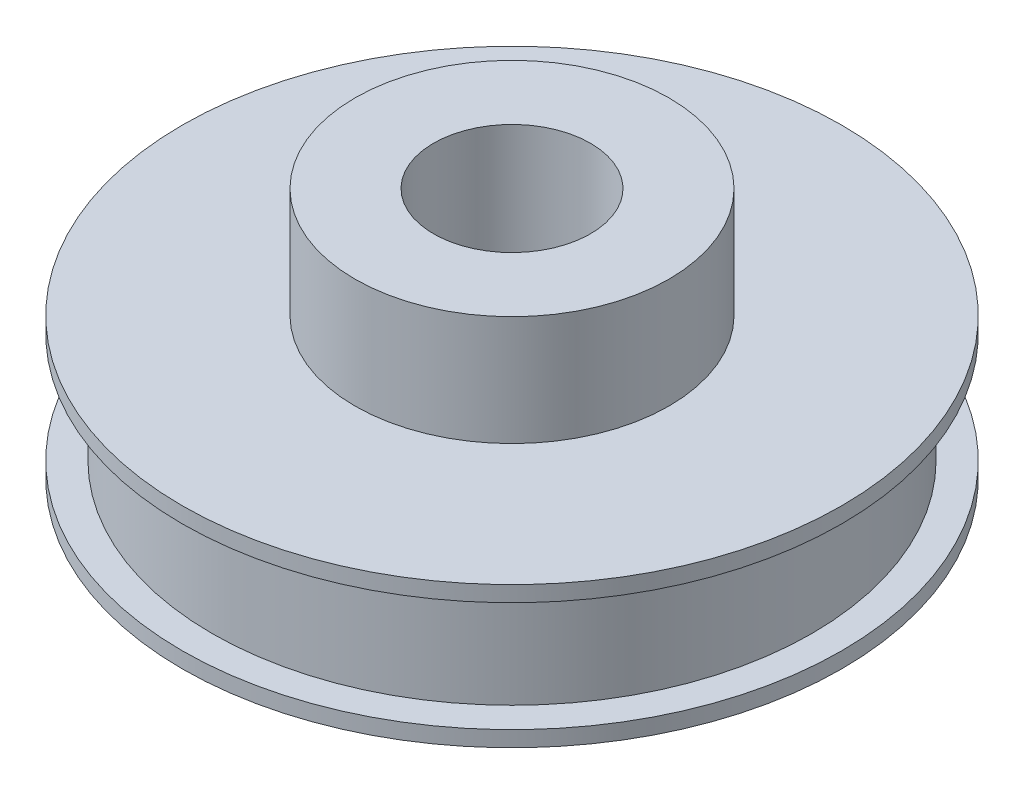
ISO-10303-21;
HEADER;
FILE_DESCRIPTION(('STEP AP214'),'2;1');
FILE_NAME('part.step','',(''),(''),'','','');
FILE_SCHEMA(('AUTOMOTIVE_DESIGN { 1 0 10303 214 1 1 1 1 }'));
ENDSEC;
DATA;
#1=APPLICATION_CONTEXT('core data for automotive mechanical design processes');
#2=APPLICATION_PROTOCOL_DEFINITION('international standard','automotive_design',2000,#1);
#3=PRODUCT_CONTEXT('',#1,'mechanical');
#4=PRODUCT('Part','Part','',(#3));
#5=PRODUCT_RELATED_PRODUCT_CATEGORY('part','',(#4));
#6=PRODUCT_DEFINITION_FORMATION('','',#4);
#7=PRODUCT_DEFINITION_CONTEXT('part definition',#1,'design');
#8=PRODUCT_DEFINITION('design','',#6,#7);
#9=PRODUCT_DEFINITION_SHAPE('','',#8);
#10=(LENGTH_UNIT() NAMED_UNIT(*) SI_UNIT(.MILLI.,.METRE.));
#11=(NAMED_UNIT(*) PLANE_ANGLE_UNIT() SI_UNIT($,.RADIAN.));
#12=(NAMED_UNIT(*) SI_UNIT($,.STERADIAN.) SOLID_ANGLE_UNIT());
#13=UNCERTAINTY_MEASURE_WITH_UNIT(LENGTH_MEASURE(1.E-05),#10,'distance_accuracy_value','');
#14=(GEOMETRIC_REPRESENTATION_CONTEXT(3) GLOBAL_UNCERTAINTY_ASSIGNED_CONTEXT((#13)) GLOBAL_UNIT_ASSIGNED_CONTEXT((#10,
#11,#12)) REPRESENTATION_CONTEXT('',''));
#15=CARTESIAN_POINT('',(0.,0.,0.));
#16=DIRECTION('',(0.,0.,1.));
#17=DIRECTION('',(1.,0.,0.));
#18=AXIS2_PLACEMENT_3D('',#15,#16,#17);
#19=CARTESIAN_POINT('',(0.,0.,0.));
#20=DIRECTION('',(0.,-1.,0.));
#21=DIRECTION('',(0.,0.,-1.));
#22=AXIS2_PLACEMENT_3D('',#19,#20,#21);
#23=CYLINDRICAL_SURFACE('',#22,10.);
#24=CARTESIAN_POINT('',(0.,16.,0.));
#25=DIRECTION('',(0.,-1.,0.));
#26=DIRECTION('',(0.,0.,-1.));
#27=AXIS2_PLACEMENT_3D('',#24,#25,#26);
#28=CIRCLE('',#27,10.);
#29=CARTESIAN_POINT('',(0.,16.,-10.));
#30=VERTEX_POINT('',#29);
#31=EDGE_CURVE('E10',#30,#30,#28,.T.);
#32=ORIENTED_EDGE('',*,*,#31,.T.);
#33=EDGE_LOOP('',(#32));
#34=FACE_BOUND('',#33,.T.);
#35=CARTESIAN_POINT('',(0.,9.,0.));
#36=DIRECTION('',(0.,-1.,0.));
#37=DIRECTION('',(0.,0.,-1.));
#38=AXIS2_PLACEMENT_3D('',#35,#36,#37);
#39=CIRCLE('',#38,10.);
#40=CARTESIAN_POINT('',(0.,9.,-10.));
#41=VERTEX_POINT('',#40);
#42=EDGE_CURVE('E69',#41,#41,#39,.T.);
#43=ORIENTED_EDGE('',*,*,#42,.F.);
#44=EDGE_LOOP('',(#43));
#45=FACE_BOUND('',#44,.T.);
#46=ADVANCED_FACE('F35',(#34,#45),#23,.T.);
#47=CARTESIAN_POINT('',(5.,16.,0.));
#48=DIRECTION('',(0.,1.,0.));
#49=DIRECTION('',(0.,0.,1.));
#50=AXIS2_PLACEMENT_3D('',#47,#48,#49);
#51=PLANE('',#50);
#52=CARTESIAN_POINT('',(0.,16.,0.));
#53=DIRECTION('',(0.,-1.,0.));
#54=DIRECTION('',(0.,0.,-1.));
#55=AXIS2_PLACEMENT_3D('',#52,#53,#54);
#56=CIRCLE('',#55,5.);
#57=CARTESIAN_POINT('',(0.,16.,-5.));
#58=VERTEX_POINT('',#57);
#59=EDGE_CURVE('E41',#58,#58,#56,.T.);
#60=ORIENTED_EDGE('',*,*,#59,.T.);
#61=EDGE_LOOP('',(#60));
#62=FACE_BOUND('',#61,.T.);
#63=ORIENTED_EDGE('',*,*,#31,.F.);
#64=EDGE_LOOP('',(#63));
#65=FACE_BOUND('',#64,.T.);
#66=ADVANCED_FACE('F77',(#62,#65),#51,.T.);
#67=CARTESIAN_POINT('',(0.,0.,0.));
#68=DIRECTION('',(0.,-1.,0.));
#69=DIRECTION('',(0.,0.,-1.));
#70=AXIS2_PLACEMENT_3D('',#67,#68,#69);
#71=CYLINDRICAL_SURFACE('',#70,5.);
#72=CARTESIAN_POINT('',(0.,0.,0.));
#73=DIRECTION('',(0.,-1.,0.));
#74=DIRECTION('',(0.,0.,-1.));
#75=AXIS2_PLACEMENT_3D('',#72,#73,#74);
#76=CIRCLE('',#75,5.);
#77=CARTESIAN_POINT('',(0.,0.,-5.));
#78=VERTEX_POINT('',#77);
#79=EDGE_CURVE('E45',#78,#78,#76,.T.);
#80=ORIENTED_EDGE('',*,*,#79,.T.);
#81=EDGE_LOOP('',(#80));
#82=FACE_BOUND('',#81,.T.);
#83=ORIENTED_EDGE('',*,*,#59,.F.);
#84=EDGE_LOOP('',(#83));
#85=FACE_BOUND('',#84,.T.);
#86=ADVANCED_FACE('F81',(#82,#85),#71,.F.);
#87=CARTESIAN_POINT('',(21.,0.,0.));
#88=DIRECTION('',(0.,-1.,0.));
#89=DIRECTION('',(0.,0.,-1.));
#90=AXIS2_PLACEMENT_3D('',#87,#88,#89);
#91=PLANE('',#90);
#92=CARTESIAN_POINT('',(0.,0.,0.));
#93=DIRECTION('',(0.,-1.,0.));
#94=DIRECTION('',(0.,0.,-1.));
#95=AXIS2_PLACEMENT_3D('',#92,#93,#94);
#96=CIRCLE('',#95,21.);
#97=CARTESIAN_POINT('',(0.,0.,-21.));
#98=VERTEX_POINT('',#97);
#99=EDGE_CURVE('E49',#98,#98,#96,.T.);
#100=ORIENTED_EDGE('',*,*,#99,.T.);
#101=EDGE_LOOP('',(#100));
#102=FACE_BOUND('',#101,.T.);
#103=ORIENTED_EDGE('',*,*,#79,.F.);
#104=EDGE_LOOP('',(#103));
#105=FACE_BOUND('',#104,.T.);
#106=ADVANCED_FACE('F85',(#102,#105),#91,.T.);
#107=CARTESIAN_POINT('',(0.,0.,0.));
#108=DIRECTION('',(0.,-1.,0.));
#109=DIRECTION('',(0.,0.,-1.));
#110=AXIS2_PLACEMENT_3D('',#107,#108,#109);
#111=CYLINDRICAL_SURFACE('',#110,21.);
#112=CARTESIAN_POINT('',(0.,0.999999999999999,0.));
#113=DIRECTION('',(0.,-1.,0.));
#114=DIRECTION('',(0.,0.,-1.));
#115=AXIS2_PLACEMENT_3D('',#112,#113,#114);
#116=CIRCLE('',#115,21.);
#117=CARTESIAN_POINT('',(0.,0.999999999999999,-21.));
#118=VERTEX_POINT('',#117);
#119=EDGE_CURVE('E54',#118,#118,#116,.T.);
#120=ORIENTED_EDGE('',*,*,#119,.T.);
#121=EDGE_LOOP('',(#120));
#122=FACE_BOUND('',#121,.T.);
#123=ORIENTED_EDGE('',*,*,#99,.F.);
#124=EDGE_LOOP('',(#123));
#125=FACE_BOUND('',#124,.T.);
#126=ADVANCED_FACE('F92',(#122,#125),#111,.T.);
#127=CARTESIAN_POINT('',(19.1,1.,0.));
#128=DIRECTION('',(0.,1.,0.));
#129=DIRECTION('',(0.,0.,1.));
#130=AXIS2_PLACEMENT_3D('',#127,#128,#129);
#131=PLANE('',#130);
#132=CARTESIAN_POINT('',(0.,1.,0.));
#133=DIRECTION('',(0.,-1.,0.));
#134=DIRECTION('',(0.,0.,-1.));
#135=AXIS2_PLACEMENT_3D('',#132,#133,#134);
#136=CIRCLE('',#135,19.1);
#137=CARTESIAN_POINT('',(0.,1.,-19.1));
#138=VERTEX_POINT('',#137);
#139=EDGE_CURVE('E57',#138,#138,#136,.T.);
#140=ORIENTED_EDGE('',*,*,#139,.T.);
#141=EDGE_LOOP('',(#140));
#142=FACE_BOUND('',#141,.T.);
#143=ORIENTED_EDGE('',*,*,#119,.F.);
#144=EDGE_LOOP('',(#143));
#145=FACE_BOUND('',#144,.T.);
#146=ADVANCED_FACE('F96',(#142,#145),#131,.T.);
#147=CARTESIAN_POINT('',(0.,0.,0.));
#148=DIRECTION('',(0.,-1.,0.));
#149=DIRECTION('',(0.,0.,-1.));
#150=AXIS2_PLACEMENT_3D('',#147,#148,#149);
#151=CYLINDRICAL_SURFACE('',#150,19.1);
#152=CARTESIAN_POINT('',(0.,8.,0.));
#153=DIRECTION('',(0.,-1.,0.));
#154=DIRECTION('',(0.,0.,-1.));
#155=AXIS2_PLACEMENT_3D('',#152,#153,#154);
#156=CIRCLE('',#155,19.1);
#157=CARTESIAN_POINT('',(0.,8.,-19.1));
#158=VERTEX_POINT('',#157);
#159=EDGE_CURVE('E60',#158,#158,#156,.T.);
#160=ORIENTED_EDGE('',*,*,#159,.T.);
#161=EDGE_LOOP('',(#160));
#162=FACE_BOUND('',#161,.T.);
#163=ORIENTED_EDGE('',*,*,#139,.F.);
#164=EDGE_LOOP('',(#163));
#165=FACE_BOUND('',#164,.T.);
#166=ADVANCED_FACE('F100',(#162,#165),#151,.T.);
#167=CARTESIAN_POINT('',(21.,8.,0.));
#168=DIRECTION('',(0.,-1.,0.));
#169=DIRECTION('',(0.,0.,-1.));
#170=AXIS2_PLACEMENT_3D('',#167,#168,#169);
#171=PLANE('',#170);
#172=CARTESIAN_POINT('',(0.,8.,0.));
#173=DIRECTION('',(0.,-1.,0.));
#174=DIRECTION('',(0.,0.,-1.));
#175=AXIS2_PLACEMENT_3D('',#172,#173,#174);
#176=CIRCLE('',#175,21.);
#177=CARTESIAN_POINT('',(0.,8.,-21.));
#178=VERTEX_POINT('',#177);
#179=EDGE_CURVE('E63',#178,#178,#176,.T.);
#180=ORIENTED_EDGE('',*,*,#179,.T.);
#181=EDGE_LOOP('',(#180));
#182=FACE_BOUND('',#181,.T.);
#183=ORIENTED_EDGE('',*,*,#159,.F.);
#184=EDGE_LOOP('',(#183));
#185=FACE_BOUND('',#184,.T.);
#186=ADVANCED_FACE('F104',(#182,#185),#171,.T.);
#187=CARTESIAN_POINT('',(0.,0.,0.));
#188=DIRECTION('',(0.,-1.,0.));
#189=DIRECTION('',(0.,0.,-1.));
#190=AXIS2_PLACEMENT_3D('',#187,#188,#189);
#191=CYLINDRICAL_SURFACE('',#190,21.);
#192=CARTESIAN_POINT('',(0.,9.,0.));
#193=DIRECTION('',(0.,-1.,0.));
#194=DIRECTION('',(0.,0.,-1.));
#195=AXIS2_PLACEMENT_3D('',#192,#193,#194);
#196=CIRCLE('',#195,21.);
#197=CARTESIAN_POINT('',(0.,9.,-21.));
#198=VERTEX_POINT('',#197);
#199=EDGE_CURVE('E66',#198,#198,#196,.T.);
#200=ORIENTED_EDGE('',*,*,#199,.T.);
#201=EDGE_LOOP('',(#200));
#202=FACE_BOUND('',#201,.T.);
#203=ORIENTED_EDGE('',*,*,#179,.F.);
#204=EDGE_LOOP('',(#203));
#205=FACE_BOUND('',#204,.T.);
#206=ADVANCED_FACE('F108',(#202,#205),#191,.T.);
#207=CARTESIAN_POINT('',(10.,9.,0.));
#208=DIRECTION('',(0.,1.,0.));
#209=DIRECTION('',(0.,0.,1.));
#210=AXIS2_PLACEMENT_3D('',#207,#208,#209);
#211=PLANE('',#210);
#212=ORIENTED_EDGE('',*,*,#42,.T.);
#213=EDGE_LOOP('',(#212));
#214=FACE_BOUND('',#213,.T.);
#215=ORIENTED_EDGE('',*,*,#199,.F.);
#216=EDGE_LOOP('',(#215));
#217=FACE_BOUND('',#216,.T.);
#218=ADVANCED_FACE('F73',(#214,#217),#211,.T.);
#219=CLOSED_SHELL('',(#46,#66,#86,#106,#126,#146,#166,#186,#206,#218));
#220=MANIFOLD_SOLID_BREP('B2',#219);
#221=ADVANCED_BREP_SHAPE_REPRESENTATION('',(#18,#220),#14);
#222=SHAPE_DEFINITION_REPRESENTATION(#9,#221);
ENDSEC;
END-ISO-10303-21;
